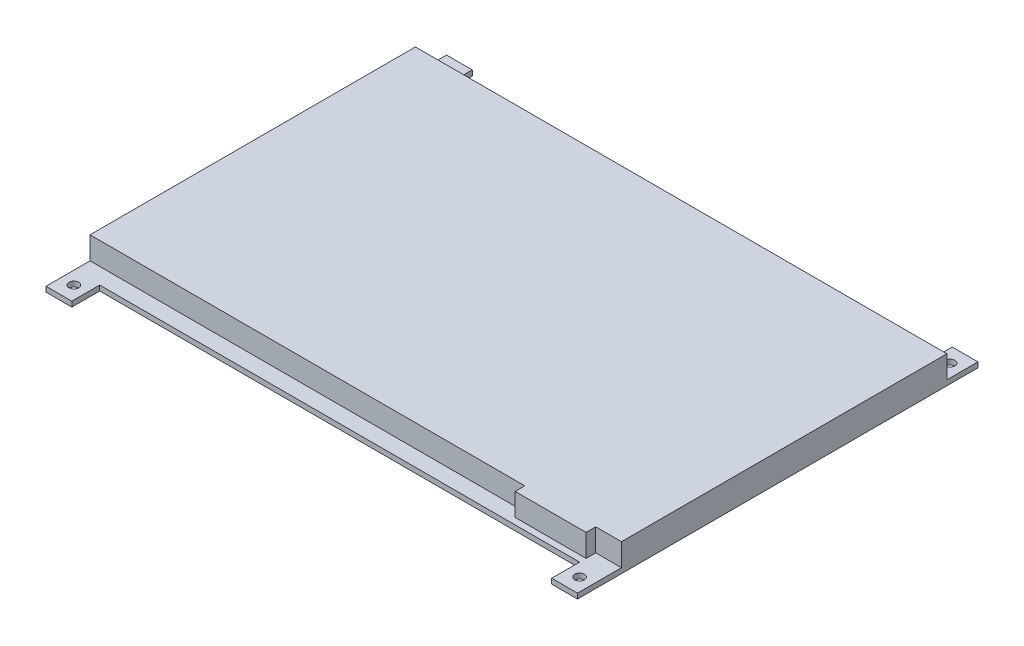
ISO-10303-21;
HEADER;
FILE_DESCRIPTION(('STEP AP214'),'2;1');
FILE_NAME('part.step','',(''),(''),'','','');
FILE_SCHEMA(('AUTOMOTIVE_DESIGN { 1 0 10303 214 1 1 1 1 }'));
ENDSEC;
DATA;
#1=APPLICATION_CONTEXT('core data for automotive mechanical design processes');
#2=APPLICATION_PROTOCOL_DEFINITION('international standard','automotive_design',2000,#1);
#3=PRODUCT_CONTEXT('',#1,'mechanical');
#4=PRODUCT('Part','Part','',(#3));
#5=PRODUCT_RELATED_PRODUCT_CATEGORY('part','',(#4));
#6=PRODUCT_DEFINITION_FORMATION('','',#4);
#7=PRODUCT_DEFINITION_CONTEXT('part definition',#1,'design');
#8=PRODUCT_DEFINITION('design','',#6,#7);
#9=PRODUCT_DEFINITION_SHAPE('','',#8);
#10=(LENGTH_UNIT() NAMED_UNIT(*) SI_UNIT(.MILLI.,.METRE.));
#11=(NAMED_UNIT(*) PLANE_ANGLE_UNIT() SI_UNIT($,.RADIAN.));
#12=(NAMED_UNIT(*) SI_UNIT($,.STERADIAN.) SOLID_ANGLE_UNIT());
#13=UNCERTAINTY_MEASURE_WITH_UNIT(LENGTH_MEASURE(1.E-05),#10,'distance_accuracy_value','');
#14=(GEOMETRIC_REPRESENTATION_CONTEXT(3) GLOBAL_UNCERTAINTY_ASSIGNED_CONTEXT((#13)) GLOBAL_UNIT_ASSIGNED_CONTEXT((#10,
#11,#12)) REPRESENTATION_CONTEXT('',''));
#15=CARTESIAN_POINT('',(0.,0.,0.));
#16=DIRECTION('',(0.,0.,1.));
#17=DIRECTION('',(1.,0.,0.));
#18=AXIS2_PLACEMENT_3D('',#15,#16,#17);
#19=CARTESIAN_POINT('',(0.,1.6,0.));
#20=DIRECTION('',(0.,-1.,0.));
#21=DIRECTION('',(0.,0.,-1.));
#22=AXIS2_PLACEMENT_3D('',#19,#20,#21);
#23=PLANE('',#22);
#24=CARTESIAN_POINT('',(-163.387715517241,1.6,-91.1550025864502));
#25=DIRECTION('',(0.,1.,0.));
#26=DIRECTION('',(0.,0.,-1.));
#27=AXIS2_PLACEMENT_3D('',#24,#25,#26);
#28=CIRCLE('',#27,1.5);
#29=CARTESIAN_POINT('',(-163.387715517241,1.6,-92.6550025864502));
#30=VERTEX_POINT('',#29);
#31=EDGE_CURVE('E196',#30,#30,#28,.T.);
#32=ORIENTED_EDGE('',*,*,#31,.F.);
#33=EDGE_LOOP('',(#32));
#34=FACE_BOUND('',#33,.T.);
#35=CARTESIAN_POINT('',(-6.48771551724151,1.6,-91.1550025864503));
#36=DIRECTION('',(0.,1.,0.));
#37=DIRECTION('',(0.,0.,-1.));
#38=AXIS2_PLACEMENT_3D('',#35,#36,#37);
#39=CIRCLE('',#38,1.5);
#40=CARTESIAN_POINT('',(-6.48771551724151,1.6,-92.6550025864503));
#41=VERTEX_POINT('',#40);
#42=EDGE_CURVE('E211',#41,#41,#39,.T.);
#43=ORIENTED_EDGE('',*,*,#42,.F.);
#44=EDGE_LOOP('',(#43));
#45=FACE_BOUND('',#44,.T.);
#46=DIRECTION('',(-1.,0.,0.));
#47=VECTOR('',#46,1.);
#48=CARTESIAN_POINT('',(-167.387715517242,1.6,-86.1550025864503));
#49=LINE('',#48,#47);
#50=CARTESIAN_POINT('',(-2.48771551724138,1.6,-86.1550025864503));
#51=VERTEX_POINT('',#50);
#52=CARTESIAN_POINT('',(-167.387715517242,1.6,-86.1550025864503));
#53=VERTEX_POINT('',#52);
#54=EDGE_CURVE('E187',#51,#53,#49,.T.);
#55=ORIENTED_EDGE('',*,*,#54,.F.);
#56=DIRECTION('',(0.,0.,-1.));
#57=VECTOR('',#56,1.);
#58=CARTESIAN_POINT('',(-2.48771551724139,1.6,19.8049974135497));
#59=LINE('',#58,#57);
#60=CARTESIAN_POINT('',(-2.4877155172415,1.6,-95.8100025864503));
#61=VERTEX_POINT('',#60);
#62=EDGE_CURVE('E226',#51,#61,#59,.T.);
#63=ORIENTED_EDGE('',*,*,#62,.T.);
#64=DIRECTION('',(-1.,0.,0.));
#65=VECTOR('',#64,1.);
#66=CARTESIAN_POINT('',(-10.4877155172415,1.6,-95.8100025864503));
#67=LINE('',#66,#65);
#68=CARTESIAN_POINT('',(-10.4877155172415,1.6,-95.8100025864503));
#69=VERTEX_POINT('',#68);
#70=EDGE_CURVE('E225',#61,#69,#67,.T.);
#71=ORIENTED_EDGE('',*,*,#70,.T.);
#72=DIRECTION('',(0.,0.,1.));
#73=VECTOR('',#72,1.);
#74=CARTESIAN_POINT('',(-10.4877155172415,1.6,-87.1550025864503));
#75=LINE('',#74,#73);
#76=CARTESIAN_POINT('',(-10.4877155172415,1.6,-87.1550025864503));
#77=VERTEX_POINT('',#76);
#78=EDGE_CURVE('E228',#69,#77,#75,.T.);
#79=ORIENTED_EDGE('',*,*,#78,.T.);
#80=DIRECTION('',(-1.,0.,0.));
#81=VECTOR('',#80,1.);
#82=CARTESIAN_POINT('',(-159.387715517242,1.6,-87.1550025864503));
#83=LINE('',#82,#81);
#84=CARTESIAN_POINT('',(-159.387715517242,1.6,-87.1550025864503));
#85=VERTEX_POINT('',#84);
#86=EDGE_CURVE('E230',#77,#85,#83,.T.);
#87=ORIENTED_EDGE('',*,*,#86,.T.);
#88=DIRECTION('',(0.,0.,-1.));
#89=VECTOR('',#88,1.);
#90=CARTESIAN_POINT('',(-159.387715517242,1.6,-95.8100025864503));
#91=LINE('',#90,#89);
#92=CARTESIAN_POINT('',(-159.387715517242,1.6,-95.8100025864503));
#93=VERTEX_POINT('',#92);
#94=EDGE_CURVE('E232',#85,#93,#91,.T.);
#95=ORIENTED_EDGE('',*,*,#94,.T.);
#96=DIRECTION('',(-1.,0.,0.));
#97=VECTOR('',#96,1.);
#98=CARTESIAN_POINT('',(-167.387715517242,1.6,-95.8100025864503));
#99=LINE('',#98,#97);
#100=CARTESIAN_POINT('',(-167.387715517242,1.6,-95.8100025864503));
#101=VERTEX_POINT('',#100);
#102=EDGE_CURVE('E234',#93,#101,#99,.T.);
#103=ORIENTED_EDGE('',*,*,#102,.T.);
#104=DIRECTION('',(0.,0.,1.));
#105=VECTOR('',#104,1.);
#106=CARTESIAN_POINT('',(-167.387715517242,1.6,-87.1550025864503));
#107=LINE('',#106,#105);
#108=EDGE_CURVE('E236',#101,#53,#107,.T.);
#109=ORIENTED_EDGE('',*,*,#108,.T.);
#110=EDGE_LOOP('',(#55,#63,#71,#79,#87,#95,#103,#109));
#111=FACE_BOUND('',#110,.T.);
#112=ADVANCED_FACE('F32',(#34,#45,#111),#23,.F.);
#113=CARTESIAN_POINT('',(-6.48771551724139,1.6,23.8049974135497));
#114=DIRECTION('',(0.,1.,0.));
#115=DIRECTION('',(0.,0.,1.));
#116=AXIS2_PLACEMENT_3D('',#113,#114,#115);
#117=CIRCLE('',#116,1.5);
#118=CARTESIAN_POINT('',(-6.48771551724139,1.6,25.3049974135497));
#119=VERTEX_POINT('',#118);
#120=EDGE_CURVE('E205',#119,#119,#117,.T.);
#121=ORIENTED_EDGE('',*,*,#120,.F.);
#122=EDGE_LOOP('',(#121));
#123=FACE_BOUND('',#122,.T.);
#124=CARTESIAN_POINT('',(-163.387715517241,1.6,23.8049974135497));
#125=DIRECTION('',(0.,1.,0.));
#126=DIRECTION('',(0.,0.,1.));
#127=AXIS2_PLACEMENT_3D('',#124,#125,#126);
#128=CIRCLE('',#127,1.5);
#129=CARTESIAN_POINT('',(-163.387715517241,1.6,25.3049974135497));
#130=VERTEX_POINT('',#129);
#131=EDGE_CURVE('E217',#130,#130,#128,.T.);
#132=ORIENTED_EDGE('',*,*,#131,.F.);
#133=EDGE_LOOP('',(#132));
#134=FACE_BOUND('',#133,.T.);
#135=DIRECTION('',(1.,0.,0.));
#136=VECTOR('',#135,1.);
#137=CARTESIAN_POINT('',(-10.4877155172414,1.6,14.8049974135497));
#138=LINE('',#137,#136);
#139=CARTESIAN_POINT('',(-10.4877155172414,1.6,14.8049974135497));
#140=VERTEX_POINT('',#139);
#141=CARTESIAN_POINT('',(-2.48771551724139,1.6,14.8049974135497));
#142=VERTEX_POINT('',#141);
#143=EDGE_CURVE('E47',#140,#142,#138,.T.);
#144=ORIENTED_EDGE('',*,*,#143,.F.);
#145=DIRECTION('',(0.,0.,-1.));
#146=VECTOR('',#145,1.);
#147=CARTESIAN_POINT('',(-10.4877155172414,1.6,17.8049974135497));
#148=LINE('',#147,#146);
#149=CARTESIAN_POINT('',(-10.4877155172414,1.6,17.8049974135497));
#150=VERTEX_POINT('',#149);
#151=EDGE_CURVE('E51',#150,#140,#148,.T.);
#152=ORIENTED_EDGE('',*,*,#151,.F.);
#153=DIRECTION('',(1.,0.,0.));
#154=VECTOR('',#153,1.);
#155=CARTESIAN_POINT('',(-32.4877155172414,1.6,17.8049974135497));
#156=LINE('',#155,#154);
#157=CARTESIAN_POINT('',(-32.4877155172414,1.6,17.8049974135497));
#158=VERTEX_POINT('',#157);
#159=EDGE_CURVE('E389',#158,#150,#156,.T.);
#160=ORIENTED_EDGE('',*,*,#159,.F.);
#161=DIRECTION('',(0.,0.,1.));
#162=VECTOR('',#161,1.);
#163=CARTESIAN_POINT('',(-32.4877155172414,1.6,14.8049974135497));
#164=LINE('',#163,#162);
#165=CARTESIAN_POINT('',(-32.4877155172414,1.6,14.8049974135497));
#166=VERTEX_POINT('',#165);
#167=EDGE_CURVE('E394',#166,#158,#164,.T.);
#168=ORIENTED_EDGE('',*,*,#167,.F.);
#169=DIRECTION('',(1.,0.,0.));
#170=VECTOR('',#169,1.);
#171=CARTESIAN_POINT('',(-167.387715517242,1.6,14.8049974135498));
#172=LINE('',#171,#170);
#173=CARTESIAN_POINT('',(-167.387715517241,1.6,14.8049974135498));
#174=VERTEX_POINT('',#173);
#175=EDGE_CURVE('E395',#174,#166,#172,.T.);
#176=ORIENTED_EDGE('',*,*,#175,.F.);
#177=CARTESIAN_POINT('',(-167.387715517241,1.6,28.4599974135497));
#178=VERTEX_POINT('',#177);
#179=EDGE_CURVE('E192',#174,#178,#107,.T.);
#180=ORIENTED_EDGE('',*,*,#179,.T.);
#181=DIRECTION('',(1.,0.,0.));
#182=VECTOR('',#181,1.);
#183=CARTESIAN_POINT('',(-159.387715517241,1.6,28.4599974135497));
#184=LINE('',#183,#182);
#185=CARTESIAN_POINT('',(-159.387715517241,1.6,28.4599974135497));
#186=VERTEX_POINT('',#185);
#187=EDGE_CURVE('E238',#178,#186,#184,.T.);
#188=ORIENTED_EDGE('',*,*,#187,.T.);
#189=DIRECTION('',(0.,0.,-1.));
#190=VECTOR('',#189,1.);
#191=CARTESIAN_POINT('',(-159.387715517242,1.6,19.8049974135497));
#192=LINE('',#191,#190);
#193=CARTESIAN_POINT('',(-159.387715517242,1.6,19.8049974135497));
#194=VERTEX_POINT('',#193);
#195=EDGE_CURVE('E240',#186,#194,#192,.T.);
#196=ORIENTED_EDGE('',*,*,#195,.T.);
#197=DIRECTION('',(1.,0.,0.));
#198=VECTOR('',#197,1.);
#199=CARTESIAN_POINT('',(-10.4877155172415,1.6,19.8049974135497));
#200=LINE('',#199,#198);
#201=CARTESIAN_POINT('',(-10.4877155172415,1.6,19.8049974135497));
#202=VERTEX_POINT('',#201);
#203=EDGE_CURVE('E242',#194,#202,#200,.T.);
#204=ORIENTED_EDGE('',*,*,#203,.T.);
#205=DIRECTION('',(0.,0.,1.));
#206=VECTOR('',#205,1.);
#207=CARTESIAN_POINT('',(-10.4877155172414,1.6,28.4599974135497));
#208=LINE('',#207,#206);
#209=CARTESIAN_POINT('',(-10.4877155172414,1.6,28.4599974135497));
#210=VERTEX_POINT('',#209);
#211=EDGE_CURVE('E244',#202,#210,#208,.T.);
#212=ORIENTED_EDGE('',*,*,#211,.T.);
#213=DIRECTION('',(1.,0.,0.));
#214=VECTOR('',#213,1.);
#215=CARTESIAN_POINT('',(-2.48771551724139,1.6,28.4599974135497));
#216=LINE('',#215,#214);
#217=CARTESIAN_POINT('',(-2.48771551724139,1.6,28.4599974135497));
#218=VERTEX_POINT('',#217);
#219=EDGE_CURVE('E246',#210,#218,#216,.T.);
#220=ORIENTED_EDGE('',*,*,#219,.T.);
#221=EDGE_CURVE('E223',#218,#142,#59,.T.);
#222=ORIENTED_EDGE('',*,*,#221,.T.);
#223=EDGE_LOOP('',(#144,#152,#160,#168,#176,#180,#188,#196,#204,#212,#220,#222));
#224=FACE_BOUND('',#223,.T.);
#225=ADVANCED_FACE('F417',(#123,#134,#224),#23,.F.);
#226=CARTESIAN_POINT('',(0.,0.,0.));
#227=DIRECTION('',(0.,-1.,0.));
#228=DIRECTION('',(0.,0.,-1.));
#229=AXIS2_PLACEMENT_3D('',#226,#227,#228);
#230=PLANE('',#229);
#231=CARTESIAN_POINT('',(-6.48771551724139,0.,23.8049974135497));
#232=DIRECTION('',(0.,1.,0.));
#233=DIRECTION('',(0.,0.,1.));
#234=AXIS2_PLACEMENT_3D('',#231,#232,#233);
#235=CIRCLE('',#234,1.5);
#236=CARTESIAN_POINT('',(-6.48771551724139,0.,25.3049974135497));
#237=VERTEX_POINT('',#236);
#238=EDGE_CURVE('E203',#237,#237,#235,.T.);
#239=ORIENTED_EDGE('',*,*,#238,.T.);
#240=EDGE_LOOP('',(#239));
#241=FACE_BOUND('',#240,.T.);
#242=CARTESIAN_POINT('',(-163.387715517241,0.,23.8049974135497));
#243=DIRECTION('',(0.,1.,0.));
#244=DIRECTION('',(0.,0.,1.));
#245=AXIS2_PLACEMENT_3D('',#242,#243,#244);
#246=CIRCLE('',#245,1.5);
#247=CARTESIAN_POINT('',(-163.387715517241,0.,25.3049974135497));
#248=VERTEX_POINT('',#247);
#249=EDGE_CURVE('E214',#248,#248,#246,.T.);
#250=ORIENTED_EDGE('',*,*,#249,.T.);
#251=EDGE_LOOP('',(#250));
#252=FACE_BOUND('',#251,.T.);
#253=DIRECTION('',(0.,0.,-1.));
#254=VECTOR('',#253,1.);
#255=CARTESIAN_POINT('',(-2.4877155172415,0.,-95.8100025864503));
#256=LINE('',#255,#254);
#257=CARTESIAN_POINT('',(-2.48771551724139,0.,28.4599974135497));
#258=VERTEX_POINT('',#257);
#259=CARTESIAN_POINT('',(-2.4877155172415,0.,-95.8100025864503));
#260=VERTEX_POINT('',#259);
#261=EDGE_CURVE('E220',#258,#260,#256,.T.);
#262=ORIENTED_EDGE('',*,*,#261,.F.);
#263=DIRECTION('',(1.,0.,0.));
#264=VECTOR('',#263,1.);
#265=CARTESIAN_POINT('',(-2.48771551724139,0.,28.4599974135497));
#266=LINE('',#265,#264);
#267=CARTESIAN_POINT('',(-10.4877155172414,0.,28.4599974135497));
#268=VERTEX_POINT('',#267);
#269=EDGE_CURVE('E271',#268,#258,#266,.T.);
#270=ORIENTED_EDGE('',*,*,#269,.F.);
#271=DIRECTION('',(0.,0.,1.));
#272=VECTOR('',#271,1.);
#273=CARTESIAN_POINT('',(-10.4877155172414,0.,28.4599974135497));
#274=LINE('',#273,#272);
#275=CARTESIAN_POINT('',(-10.4877155172415,0.,19.8049974135497));
#276=VERTEX_POINT('',#275);
#277=EDGE_CURVE('E269',#276,#268,#274,.T.);
#278=ORIENTED_EDGE('',*,*,#277,.F.);
#279=DIRECTION('',(1.,0.,0.));
#280=VECTOR('',#279,1.);
#281=CARTESIAN_POINT('',(-10.4877155172415,0.,19.8049974135497));
#282=LINE('',#281,#280);
#283=CARTESIAN_POINT('',(-159.387715517242,0.,19.8049974135497));
#284=VERTEX_POINT('',#283);
#285=EDGE_CURVE('E267',#284,#276,#282,.T.);
#286=ORIENTED_EDGE('',*,*,#285,.F.);
#287=DIRECTION('',(0.,0.,-1.));
#288=VECTOR('',#287,1.);
#289=CARTESIAN_POINT('',(-159.387715517242,0.,19.8049974135497));
#290=LINE('',#289,#288);
#291=CARTESIAN_POINT('',(-159.387715517241,0.,28.4599974135497));
#292=VERTEX_POINT('',#291);
#293=EDGE_CURVE('E265',#292,#284,#290,.T.);
#294=ORIENTED_EDGE('',*,*,#293,.F.);
#295=DIRECTION('',(1.,0.,0.));
#296=VECTOR('',#295,1.);
#297=CARTESIAN_POINT('',(-159.387715517241,0.,28.4599974135497));
#298=LINE('',#297,#296);
#299=CARTESIAN_POINT('',(-167.387715517241,0.,28.4599974135497));
#300=VERTEX_POINT('',#299);
#301=EDGE_CURVE('E263',#300,#292,#298,.T.);
#302=ORIENTED_EDGE('',*,*,#301,.F.);
#303=DIRECTION('',(0.,0.,1.));
#304=VECTOR('',#303,1.);
#305=CARTESIAN_POINT('',(-167.387715517241,0.,28.4599974135497));
#306=LINE('',#305,#304);
#307=CARTESIAN_POINT('',(-167.387715517242,0.,-95.8100025864503));
#308=VERTEX_POINT('',#307);
#309=EDGE_CURVE('E261',#308,#300,#306,.T.);
#310=ORIENTED_EDGE('',*,*,#309,.F.);
#311=DIRECTION('',(-1.,0.,0.));
#312=VECTOR('',#311,1.);
#313=CARTESIAN_POINT('',(-167.387715517242,0.,-95.8100025864503));
#314=LINE('',#313,#312);
#315=CARTESIAN_POINT('',(-159.387715517242,0.,-95.8100025864503));
#316=VERTEX_POINT('',#315);
#317=EDGE_CURVE('E258',#316,#308,#314,.T.);
#318=ORIENTED_EDGE('',*,*,#317,.F.);
#319=DIRECTION('',(0.,0.,-1.));
#320=VECTOR('',#319,1.);
#321=CARTESIAN_POINT('',(-159.387715517242,0.,-95.8100025864503));
#322=LINE('',#321,#320);
#323=CARTESIAN_POINT('',(-159.387715517242,0.,-87.1550025864503));
#324=VERTEX_POINT('',#323);
#325=EDGE_CURVE('E256',#324,#316,#322,.T.);
#326=ORIENTED_EDGE('',*,*,#325,.F.);
#327=DIRECTION('',(-1.,0.,0.));
#328=VECTOR('',#327,1.);
#329=CARTESIAN_POINT('',(-159.387715517242,0.,-87.1550025864503));
#330=LINE('',#329,#328);
#331=CARTESIAN_POINT('',(-10.4877155172415,0.,-87.1550025864503));
#332=VERTEX_POINT('',#331);
#333=EDGE_CURVE('E254',#332,#324,#330,.T.);
#334=ORIENTED_EDGE('',*,*,#333,.F.);
#335=DIRECTION('',(0.,0.,1.));
#336=VECTOR('',#335,1.);
#337=CARTESIAN_POINT('',(-10.4877155172415,0.,-87.1550025864503));
#338=LINE('',#337,#336);
#339=CARTESIAN_POINT('',(-10.4877155172415,0.,-95.8100025864503));
#340=VERTEX_POINT('',#339);
#341=EDGE_CURVE('E252',#340,#332,#338,.T.);
#342=ORIENTED_EDGE('',*,*,#341,.F.);
#343=DIRECTION('',(-1.,0.,0.));
#344=VECTOR('',#343,1.);
#345=CARTESIAN_POINT('',(-10.4877155172415,0.,-95.8100025864503));
#346=LINE('',#345,#344);
#347=EDGE_CURVE('E250',#260,#340,#346,.T.);
#348=ORIENTED_EDGE('',*,*,#347,.F.);
#349=EDGE_LOOP('',(#262,#270,#278,#286,#294,#302,#310,#318,#326,#334,#342,#348));
#350=FACE_BOUND('',#349,.T.);
#351=CARTESIAN_POINT('',(-6.48771551724151,0.,-91.1550025864503));
#352=DIRECTION('',(0.,1.,0.));
#353=DIRECTION('',(0.,0.,-1.));
#354=AXIS2_PLACEMENT_3D('',#351,#352,#353);
#355=CIRCLE('',#354,1.5);
#356=CARTESIAN_POINT('',(-6.48771551724151,0.,-92.6550025864503));
#357=VERTEX_POINT('',#356);
#358=EDGE_CURVE('E208',#357,#357,#355,.T.);
#359=ORIENTED_EDGE('',*,*,#358,.T.);
#360=EDGE_LOOP('',(#359));
#361=FACE_BOUND('',#360,.T.);
#362=CARTESIAN_POINT('',(-163.387715517241,0.,-91.1550025864502));
#363=DIRECTION('',(0.,1.,0.));
#364=DIRECTION('',(0.,0.,-1.));
#365=AXIS2_PLACEMENT_3D('',#362,#363,#364);
#366=CIRCLE('',#365,1.5);
#367=CARTESIAN_POINT('',(-163.387715517241,0.,-92.6550025864502));
#368=VERTEX_POINT('',#367);
#369=EDGE_CURVE('E193',#368,#368,#366,.T.);
#370=ORIENTED_EDGE('',*,*,#369,.T.);
#371=EDGE_LOOP('',(#370));
#372=FACE_BOUND('',#371,.T.);
#373=ADVANCED_FACE('F314',(#241,#252,#350,#361,#372),#230,.T.);
#374=CARTESIAN_POINT('',(-2.4877155172415,1.6,-95.8100025864503));
#375=DIRECTION('',(-1.,0.,0.));
#376=DIRECTION('',(0.,0.,1.));
#377=AXIS2_PLACEMENT_3D('',#374,#375,#376);
#378=PLANE('',#377);
#379=ORIENTED_EDGE('',*,*,#261,.T.);
#380=DIRECTION('',(0.,-1.,0.));
#381=VECTOR('',#380,1.);
#382=CARTESIAN_POINT('',(-2.4877155172415,1.6,-95.8100025864503));
#383=LINE('',#382,#381);
#384=EDGE_CURVE('E11',#61,#260,#383,.T.);
#385=ORIENTED_EDGE('',*,*,#384,.F.);
#386=ORIENTED_EDGE('',*,*,#62,.F.);
#387=DIRECTION('',(0.,-1.,0.));
#388=VECTOR('',#387,1.);
#389=CARTESIAN_POINT('',(-2.48771551724139,8.6,-86.1550025864503));
#390=LINE('',#389,#388);
#391=CARTESIAN_POINT('',(-2.48771551724139,8.6,-86.1550025864503));
#392=VERTEX_POINT('',#391);
#393=EDGE_CURVE('E368',#392,#51,#390,.T.);
#394=ORIENTED_EDGE('',*,*,#393,.F.);
#395=DIRECTION('',(0.,0.,-1.));
#396=VECTOR('',#395,1.);
#397=CARTESIAN_POINT('',(-2.48771551724139,8.6,-86.1550025864503));
#398=LINE('',#397,#396);
#399=CARTESIAN_POINT('',(-2.48771551724138,8.6,14.8049974135497));
#400=VERTEX_POINT('',#399);
#401=EDGE_CURVE('E410',#400,#392,#398,.T.);
#402=ORIENTED_EDGE('',*,*,#401,.F.);
#403=DIRECTION('',(0.,-1.,0.));
#404=VECTOR('',#403,1.);
#405=CARTESIAN_POINT('',(-2.48771551724138,8.6,14.8049974135497));
#406=LINE('',#405,#404);
#407=EDGE_CURVE('E375',#400,#142,#406,.T.);
#408=ORIENTED_EDGE('',*,*,#407,.T.);
#409=ORIENTED_EDGE('',*,*,#221,.F.);
#410=DIRECTION('',(0.,-1.,0.));
#411=VECTOR('',#410,1.);
#412=CARTESIAN_POINT('',(-2.48771551724139,1.6,28.4599974135497));
#413=LINE('',#412,#411);
#414=EDGE_CURVE('E248',#218,#258,#413,.T.);
#415=ORIENTED_EDGE('',*,*,#414,.T.);
#416=EDGE_LOOP('',(#379,#385,#386,#394,#402,#408,#409,#415));
#417=FACE_BOUND('',#416,.T.);
#418=ADVANCED_FACE('F34',(#417),#378,.F.);
#419=CARTESIAN_POINT('',(-10.4877155172415,1.6,-95.8100025864503));
#420=DIRECTION('',(0.,0.,1.));
#421=DIRECTION('',(1.,0.,0.));
#422=AXIS2_PLACEMENT_3D('',#419,#420,#421);
#423=PLANE('',#422);
#424=ORIENTED_EDGE('',*,*,#347,.T.);
#425=DIRECTION('',(0.,-1.,0.));
#426=VECTOR('',#425,1.);
#427=CARTESIAN_POINT('',(-10.4877155172415,1.6,-95.8100025864503));
#428=LINE('',#427,#426);
#429=EDGE_CURVE('E40',#69,#340,#428,.T.);
#430=ORIENTED_EDGE('',*,*,#429,.F.);
#431=ORIENTED_EDGE('',*,*,#70,.F.);
#432=ORIENTED_EDGE('',*,*,#384,.T.);
#433=EDGE_LOOP('',(#424,#430,#431,#432));
#434=FACE_BOUND('',#433,.T.);
#435=ADVANCED_FACE('F331',(#434),#423,.F.);
#436=CARTESIAN_POINT('',(-10.4877155172415,1.6,-87.1550025864503));
#437=DIRECTION('',(1.,0.,0.));
#438=DIRECTION('',(0.,0.,-1.));
#439=AXIS2_PLACEMENT_3D('',#436,#437,#438);
#440=PLANE('',#439);
#441=ORIENTED_EDGE('',*,*,#341,.T.);
#442=DIRECTION('',(0.,-1.,0.));
#443=VECTOR('',#442,1.);
#444=CARTESIAN_POINT('',(-10.4877155172415,1.6,-87.1550025864503));
#445=LINE('',#444,#443);
#446=EDGE_CURVE('E300',#77,#332,#445,.T.);
#447=ORIENTED_EDGE('',*,*,#446,.F.);
#448=ORIENTED_EDGE('',*,*,#78,.F.);
#449=ORIENTED_EDGE('',*,*,#429,.T.);
#450=EDGE_LOOP('',(#441,#447,#448,#449));
#451=FACE_BOUND('',#450,.T.);
#452=ADVANCED_FACE('F307',(#451),#440,.F.);
#453=CARTESIAN_POINT('',(-159.387715517242,1.6,-87.1550025864503));
#454=DIRECTION('',(0.,0.,1.));
#455=DIRECTION('',(1.,0.,0.));
#456=AXIS2_PLACEMENT_3D('',#453,#454,#455);
#457=PLANE('',#456);
#458=ORIENTED_EDGE('',*,*,#333,.T.);
#459=DIRECTION('',(0.,-1.,0.));
#460=VECTOR('',#459,1.);
#461=CARTESIAN_POINT('',(-159.387715517242,1.6,-87.1550025864503));
#462=LINE('',#461,#460);
#463=EDGE_CURVE('E297',#85,#324,#462,.T.);
#464=ORIENTED_EDGE('',*,*,#463,.F.);
#465=ORIENTED_EDGE('',*,*,#86,.F.);
#466=ORIENTED_EDGE('',*,*,#446,.T.);
#467=EDGE_LOOP('',(#458,#464,#465,#466));
#468=FACE_BOUND('',#467,.T.);
#469=ADVANCED_FACE('F320',(#468),#457,.F.);
#470=CARTESIAN_POINT('',(-159.387715517242,1.6,-95.8100025864503));
#471=DIRECTION('',(-1.,0.,0.));
#472=DIRECTION('',(0.,0.,1.));
#473=AXIS2_PLACEMENT_3D('',#470,#471,#472);
#474=PLANE('',#473);
#475=ORIENTED_EDGE('',*,*,#325,.T.);
#476=DIRECTION('',(0.,-1.,0.));
#477=VECTOR('',#476,1.);
#478=CARTESIAN_POINT('',(-159.387715517242,1.6,-95.8100025864503));
#479=LINE('',#478,#477);
#480=EDGE_CURVE('E294',#93,#316,#479,.T.);
#481=ORIENTED_EDGE('',*,*,#480,.F.);
#482=ORIENTED_EDGE('',*,*,#94,.F.);
#483=ORIENTED_EDGE('',*,*,#463,.T.);
#484=EDGE_LOOP('',(#475,#481,#482,#483));
#485=FACE_BOUND('',#484,.T.);
#486=ADVANCED_FACE('F324',(#485),#474,.F.);
#487=CARTESIAN_POINT('',(-167.387715517242,1.6,-95.8100025864503));
#488=DIRECTION('',(0.,0.,1.));
#489=DIRECTION('',(1.,0.,0.));
#490=AXIS2_PLACEMENT_3D('',#487,#488,#489);
#491=PLANE('',#490);
#492=ORIENTED_EDGE('',*,*,#317,.T.);
#493=DIRECTION('',(0.,-1.,0.));
#494=VECTOR('',#493,1.);
#495=CARTESIAN_POINT('',(-167.387715517242,1.6,-95.8100025864503));
#496=LINE('',#495,#494);
#497=EDGE_CURVE('E291',#101,#308,#496,.T.);
#498=ORIENTED_EDGE('',*,*,#497,.F.);
#499=ORIENTED_EDGE('',*,*,#102,.F.);
#500=ORIENTED_EDGE('',*,*,#480,.T.);
#501=EDGE_LOOP('',(#492,#498,#499,#500));
#502=FACE_BOUND('',#501,.T.);
#503=ADVANCED_FACE('F362',(#502),#491,.F.);
#504=CARTESIAN_POINT('',(-167.387715517241,1.6,28.4599974135497));
#505=DIRECTION('',(1.,0.,0.));
#506=DIRECTION('',(0.,0.,-1.));
#507=AXIS2_PLACEMENT_3D('',#504,#505,#506);
#508=PLANE('',#507);
#509=ORIENTED_EDGE('',*,*,#309,.T.);
#510=DIRECTION('',(0.,-1.,0.));
#511=VECTOR('',#510,1.);
#512=CARTESIAN_POINT('',(-167.387715517241,1.6,28.4599974135497));
#513=LINE('',#512,#511);
#514=EDGE_CURVE('E288',#178,#300,#513,.T.);
#515=ORIENTED_EDGE('',*,*,#514,.F.);
#516=ORIENTED_EDGE('',*,*,#179,.F.);
#517=DIRECTION('',(0.,-1.,0.));
#518=VECTOR('',#517,1.);
#519=CARTESIAN_POINT('',(-167.387715517242,8.6,14.8049974135498));
#520=LINE('',#519,#518);
#521=CARTESIAN_POINT('',(-167.387715517242,8.6,14.8049974135498));
#522=VERTEX_POINT('',#521);
#523=EDGE_CURVE('E172',#522,#174,#520,.T.);
#524=ORIENTED_EDGE('',*,*,#523,.F.);
#525=DIRECTION('',(0.,0.,1.));
#526=VECTOR('',#525,1.);
#527=CARTESIAN_POINT('',(-167.387715517242,8.6,-86.1550025864503));
#528=LINE('',#527,#526);
#529=CARTESIAN_POINT('',(-167.387715517242,8.6,-86.1550025864503));
#530=VERTEX_POINT('',#529);
#531=EDGE_CURVE('E178',#530,#522,#528,.T.);
#532=ORIENTED_EDGE('',*,*,#531,.F.);
#533=DIRECTION('',(0.,-1.,0.));
#534=VECTOR('',#533,1.);
#535=CARTESIAN_POINT('',(-167.387715517242,8.6,-86.1550025864503));
#536=LINE('',#535,#534);
#537=EDGE_CURVE('E364',#530,#53,#536,.T.);
#538=ORIENTED_EDGE('',*,*,#537,.T.);
#539=ORIENTED_EDGE('',*,*,#108,.F.);
#540=ORIENTED_EDGE('',*,*,#497,.T.);
#541=EDGE_LOOP('',(#509,#515,#516,#524,#532,#538,#539,#540));
#542=FACE_BOUND('',#541,.T.);
#543=ADVANCED_FACE('F190',(#542),#508,.F.);
#544=CARTESIAN_POINT('',(-159.387715517241,1.6,28.4599974135497));
#545=DIRECTION('',(0.,0.,-1.));
#546=DIRECTION('',(-1.,0.,0.));
#547=AXIS2_PLACEMENT_3D('',#544,#545,#546);
#548=PLANE('',#547);
#549=ORIENTED_EDGE('',*,*,#301,.T.);
#550=DIRECTION('',(0.,-1.,0.));
#551=VECTOR('',#550,1.);
#552=CARTESIAN_POINT('',(-159.387715517241,1.6,28.4599974135497));
#553=LINE('',#552,#551);
#554=EDGE_CURVE('E285',#186,#292,#553,.T.);
#555=ORIENTED_EDGE('',*,*,#554,.F.);
#556=ORIENTED_EDGE('',*,*,#187,.F.);
#557=ORIENTED_EDGE('',*,*,#514,.T.);
#558=EDGE_LOOP('',(#549,#555,#556,#557));
#559=FACE_BOUND('',#558,.T.);
#560=ADVANCED_FACE('F360',(#559),#548,.F.);
#561=CARTESIAN_POINT('',(-159.387715517242,1.6,19.8049974135497));
#562=DIRECTION('',(-1.,0.,0.));
#563=DIRECTION('',(0.,0.,1.));
#564=AXIS2_PLACEMENT_3D('',#561,#562,#563);
#565=PLANE('',#564);
#566=ORIENTED_EDGE('',*,*,#293,.T.);
#567=DIRECTION('',(0.,-1.,0.));
#568=VECTOR('',#567,1.);
#569=CARTESIAN_POINT('',(-159.387715517242,1.6,19.8049974135497));
#570=LINE('',#569,#568);
#571=EDGE_CURVE('E282',#194,#284,#570,.T.);
#572=ORIENTED_EDGE('',*,*,#571,.F.);
#573=ORIENTED_EDGE('',*,*,#195,.F.);
#574=ORIENTED_EDGE('',*,*,#554,.T.);
#575=EDGE_LOOP('',(#566,#572,#573,#574));
#576=FACE_BOUND('',#575,.T.);
#577=ADVANCED_FACE('F356',(#576),#565,.F.);
#578=CARTESIAN_POINT('',(-10.4877155172415,1.6,19.8049974135497));
#579=DIRECTION('',(0.,0.,-1.));
#580=DIRECTION('',(-1.,0.,0.));
#581=AXIS2_PLACEMENT_3D('',#578,#579,#580);
#582=PLANE('',#581);
#583=ORIENTED_EDGE('',*,*,#285,.T.);
#584=DIRECTION('',(0.,-1.,0.));
#585=VECTOR('',#584,1.);
#586=CARTESIAN_POINT('',(-10.4877155172415,1.6,19.8049974135497));
#587=LINE('',#586,#585);
#588=EDGE_CURVE('E279',#202,#276,#587,.T.);
#589=ORIENTED_EDGE('',*,*,#588,.F.);
#590=ORIENTED_EDGE('',*,*,#203,.F.);
#591=ORIENTED_EDGE('',*,*,#571,.T.);
#592=EDGE_LOOP('',(#583,#589,#590,#591));
#593=FACE_BOUND('',#592,.T.);
#594=ADVANCED_FACE('F351',(#593),#582,.F.);
#595=CARTESIAN_POINT('',(-10.4877155172414,1.6,28.4599974135497));
#596=DIRECTION('',(1.,0.,0.));
#597=DIRECTION('',(0.,0.,-1.));
#598=AXIS2_PLACEMENT_3D('',#595,#596,#597);
#599=PLANE('',#598);
#600=ORIENTED_EDGE('',*,*,#277,.T.);
#601=DIRECTION('',(0.,-1.,0.));
#602=VECTOR('',#601,1.);
#603=CARTESIAN_POINT('',(-10.4877155172414,1.6,28.4599974135497));
#604=LINE('',#603,#602);
#605=EDGE_CURVE('E276',#210,#268,#604,.T.);
#606=ORIENTED_EDGE('',*,*,#605,.F.);
#607=ORIENTED_EDGE('',*,*,#211,.F.);
#608=ORIENTED_EDGE('',*,*,#588,.T.);
#609=EDGE_LOOP('',(#600,#606,#607,#608));
#610=FACE_BOUND('',#609,.T.);
#611=ADVANCED_FACE('F345',(#610),#599,.F.);
#612=CARTESIAN_POINT('',(-2.48771551724139,1.6,28.4599974135497));
#613=DIRECTION('',(0.,0.,-1.));
#614=DIRECTION('',(-1.,0.,0.));
#615=AXIS2_PLACEMENT_3D('',#612,#613,#614);
#616=PLANE('',#615);
#617=ORIENTED_EDGE('',*,*,#269,.T.);
#618=ORIENTED_EDGE('',*,*,#414,.F.);
#619=ORIENTED_EDGE('',*,*,#219,.F.);
#620=ORIENTED_EDGE('',*,*,#605,.T.);
#621=EDGE_LOOP('',(#617,#618,#619,#620));
#622=FACE_BOUND('',#621,.T.);
#623=ADVANCED_FACE('F340',(#622),#616,.F.);
#624=CARTESIAN_POINT('',(-163.387715517241,1.6,23.8049974135497));
#625=DIRECTION('',(0.,-1.,0.));
#626=DIRECTION('',(0.,0.,-1.));
#627=AXIS2_PLACEMENT_3D('',#624,#625,#626);
#628=CYLINDRICAL_SURFACE('',#627,1.5);
#629=ORIENTED_EDGE('',*,*,#131,.T.);
#630=EDGE_LOOP('',(#629));
#631=FACE_BOUND('',#630,.T.);
#632=ORIENTED_EDGE('',*,*,#249,.F.);
#633=EDGE_LOOP('',(#632));
#634=FACE_BOUND('',#633,.T.);
#635=ADVANCED_FACE('F431',(#631,#634),#628,.F.);
#636=CARTESIAN_POINT('',(-6.48771551724151,1.6,-91.1550025864503));
#637=DIRECTION('',(0.,-1.,0.));
#638=DIRECTION('',(0.,0.,-1.));
#639=AXIS2_PLACEMENT_3D('',#636,#637,#638);
#640=CYLINDRICAL_SURFACE('',#639,1.5);
#641=ORIENTED_EDGE('',*,*,#42,.T.);
#642=EDGE_LOOP('',(#641));
#643=FACE_BOUND('',#642,.T.);
#644=ORIENTED_EDGE('',*,*,#358,.F.);
#645=EDGE_LOOP('',(#644));
#646=FACE_BOUND('',#645,.T.);
#647=ADVANCED_FACE('F535',(#643,#646),#640,.F.);
#648=CARTESIAN_POINT('',(-6.48771551724139,1.6,23.8049974135497));
#649=DIRECTION('',(0.,-1.,0.));
#650=DIRECTION('',(0.,0.,-1.));
#651=AXIS2_PLACEMENT_3D('',#648,#649,#650);
#652=CYLINDRICAL_SURFACE('',#651,1.5);
#653=ORIENTED_EDGE('',*,*,#120,.T.);
#654=EDGE_LOOP('',(#653));
#655=FACE_BOUND('',#654,.T.);
#656=ORIENTED_EDGE('',*,*,#238,.F.);
#657=EDGE_LOOP('',(#656));
#658=FACE_BOUND('',#657,.T.);
#659=ADVANCED_FACE('F544',(#655,#658),#652,.F.);
#660=CARTESIAN_POINT('',(-163.387715517241,1.6,-91.1550025864502));
#661=DIRECTION('',(0.,-1.,0.));
#662=DIRECTION('',(0.,0.,-1.));
#663=AXIS2_PLACEMENT_3D('',#660,#661,#662);
#664=CYLINDRICAL_SURFACE('',#663,1.5);
#665=ORIENTED_EDGE('',*,*,#31,.T.);
#666=EDGE_LOOP('',(#665));
#667=FACE_BOUND('',#666,.T.);
#668=ORIENTED_EDGE('',*,*,#369,.F.);
#669=EDGE_LOOP('',(#668));
#670=FACE_BOUND('',#669,.T.);
#671=ADVANCED_FACE('F553',(#667,#670),#664,.F.);
#672=CARTESIAN_POINT('',(-167.387715517242,8.6,14.8049974135498));
#673=DIRECTION('',(0.,0.,-1.));
#674=DIRECTION('',(-1.,0.,0.));
#675=AXIS2_PLACEMENT_3D('',#672,#673,#674);
#676=PLANE('',#675);
#677=ORIENTED_EDGE('',*,*,#175,.T.);
#678=DIRECTION('',(0.,-1.,0.));
#679=VECTOR('',#678,1.);
#680=CARTESIAN_POINT('',(-32.4877155172414,8.6,14.8049974135497));
#681=LINE('',#680,#679);
#682=CARTESIAN_POINT('',(-32.4877155172414,8.6,14.8049974135497));
#683=VERTEX_POINT('',#682);
#684=EDGE_CURVE('E174',#683,#166,#681,.T.);
#685=ORIENTED_EDGE('',*,*,#684,.F.);
#686=DIRECTION('',(1.,0.,0.));
#687=VECTOR('',#686,1.);
#688=CARTESIAN_POINT('',(-167.387715517242,8.6,14.8049974135498));
#689=LINE('',#688,#687);
#690=EDGE_CURVE('E167',#522,#683,#689,.T.);
#691=ORIENTED_EDGE('',*,*,#690,.F.);
#692=ORIENTED_EDGE('',*,*,#523,.T.);
#693=EDGE_LOOP('',(#677,#685,#691,#692));
#694=FACE_BOUND('',#693,.T.);
#695=ADVANCED_FACE('F170',(#694),#676,.F.);
#696=CARTESIAN_POINT('',(-32.4877155172414,8.6,14.8049974135497));
#697=DIRECTION('',(1.,0.,0.));
#698=DIRECTION('',(0.,0.,-1.));
#699=AXIS2_PLACEMENT_3D('',#696,#697,#698);
#700=PLANE('',#699);
#701=ORIENTED_EDGE('',*,*,#167,.T.);
#702=DIRECTION('',(0.,-1.,0.));
#703=VECTOR('',#702,1.);
#704=CARTESIAN_POINT('',(-32.4877155172414,8.6,17.8049974135497));
#705=LINE('',#704,#703);
#706=CARTESIAN_POINT('',(-32.4877155172414,8.6,17.8049974135497));
#707=VERTEX_POINT('',#706);
#708=EDGE_CURVE('E198',#707,#158,#705,.T.);
#709=ORIENTED_EDGE('',*,*,#708,.F.);
#710=DIRECTION('',(0.,0.,1.));
#711=VECTOR('',#710,1.);
#712=CARTESIAN_POINT('',(-32.4877155172414,8.6,14.8049974135497));
#713=LINE('',#712,#711);
#714=EDGE_CURVE('E177',#683,#707,#713,.T.);
#715=ORIENTED_EDGE('',*,*,#714,.F.);
#716=ORIENTED_EDGE('',*,*,#684,.T.);
#717=EDGE_LOOP('',(#701,#709,#715,#716));
#718=FACE_BOUND('',#717,.T.);
#719=ADVANCED_FACE('F393',(#718),#700,.F.);
#720=CARTESIAN_POINT('',(-32.4877155172414,8.6,17.8049974135497));
#721=DIRECTION('',(0.,0.,-1.));
#722=DIRECTION('',(-1.,0.,0.));
#723=AXIS2_PLACEMENT_3D('',#720,#721,#722);
#724=PLANE('',#723);
#725=ORIENTED_EDGE('',*,*,#159,.T.);
#726=DIRECTION('',(0.,-1.,0.));
#727=VECTOR('',#726,1.);
#728=CARTESIAN_POINT('',(-10.4877155172414,8.6,17.8049974135497));
#729=LINE('',#728,#727);
#730=CARTESIAN_POINT('',(-10.4877155172414,8.6,17.8049974135497));
#731=VERTEX_POINT('',#730);
#732=EDGE_CURVE('E381',#731,#150,#729,.T.);
#733=ORIENTED_EDGE('',*,*,#732,.F.);
#734=DIRECTION('',(1.,0.,0.));
#735=VECTOR('',#734,1.);
#736=CARTESIAN_POINT('',(-32.4877155172414,8.6,17.8049974135497));
#737=LINE('',#736,#735);
#738=EDGE_CURVE('E390',#707,#731,#737,.T.);
#739=ORIENTED_EDGE('',*,*,#738,.F.);
#740=ORIENTED_EDGE('',*,*,#708,.T.);
#741=EDGE_LOOP('',(#725,#733,#739,#740));
#742=FACE_BOUND('',#741,.T.);
#743=ADVANCED_FACE('F387',(#742),#724,.F.);
#744=CARTESIAN_POINT('',(-10.4877155172414,8.6,17.8049974135497));
#745=DIRECTION('',(-1.,0.,0.));
#746=DIRECTION('',(0.,0.,1.));
#747=AXIS2_PLACEMENT_3D('',#744,#745,#746);
#748=PLANE('',#747);
#749=ORIENTED_EDGE('',*,*,#151,.T.);
#750=DIRECTION('',(0.,-1.,0.));
#751=VECTOR('',#750,1.);
#752=CARTESIAN_POINT('',(-10.4877155172414,8.6,14.8049974135497));
#753=LINE('',#752,#751);
#754=CARTESIAN_POINT('',(-10.4877155172414,8.6,14.8049974135497));
#755=VERTEX_POINT('',#754);
#756=EDGE_CURVE('E378',#755,#140,#753,.T.);
#757=ORIENTED_EDGE('',*,*,#756,.F.);
#758=DIRECTION('',(0.,0.,-1.));
#759=VECTOR('',#758,1.);
#760=CARTESIAN_POINT('',(-10.4877155172414,8.6,17.8049974135497));
#761=LINE('',#760,#759);
#762=EDGE_CURVE('E411',#731,#755,#761,.T.);
#763=ORIENTED_EDGE('',*,*,#762,.F.);
#764=ORIENTED_EDGE('',*,*,#732,.T.);
#765=EDGE_LOOP('',(#749,#757,#763,#764));
#766=FACE_BOUND('',#765,.T.);
#767=ADVANCED_FACE('F402',(#766),#748,.F.);
#768=CARTESIAN_POINT('',(-10.4877155172414,8.6,14.8049974135497));
#769=DIRECTION('',(0.,0.,-1.));
#770=DIRECTION('',(-1.,0.,0.));
#771=AXIS2_PLACEMENT_3D('',#768,#769,#770);
#772=PLANE('',#771);
#773=ORIENTED_EDGE('',*,*,#143,.T.);
#774=ORIENTED_EDGE('',*,*,#407,.F.);
#775=DIRECTION('',(1.,0.,0.));
#776=VECTOR('',#775,1.);
#777=CARTESIAN_POINT('',(-10.4877155172414,8.6,14.8049974135497));
#778=LINE('',#777,#776);
#779=EDGE_CURVE('E408',#755,#400,#778,.T.);
#780=ORIENTED_EDGE('',*,*,#779,.F.);
#781=ORIENTED_EDGE('',*,*,#756,.T.);
#782=EDGE_LOOP('',(#773,#774,#780,#781));
#783=FACE_BOUND('',#782,.T.);
#784=ADVANCED_FACE('F406',(#783),#772,.F.);
#785=CARTESIAN_POINT('',(-167.387715517242,8.6,-86.1550025864503));
#786=DIRECTION('',(0.,0.,1.));
#787=DIRECTION('',(1.,0.,0.));
#788=AXIS2_PLACEMENT_3D('',#785,#786,#787);
#789=PLANE('',#788);
#790=ORIENTED_EDGE('',*,*,#54,.T.);
#791=ORIENTED_EDGE('',*,*,#537,.F.);
#792=DIRECTION('',(-1.,0.,0.));
#793=VECTOR('',#792,1.);
#794=CARTESIAN_POINT('',(-167.387715517242,8.6,-86.1550025864503));
#795=LINE('',#794,#793);
#796=EDGE_CURVE('E183',#392,#530,#795,.T.);
#797=ORIENTED_EDGE('',*,*,#796,.F.);
#798=ORIENTED_EDGE('',*,*,#393,.T.);
#799=EDGE_LOOP('',(#790,#791,#797,#798));
#800=FACE_BOUND('',#799,.T.);
#801=ADVANCED_FACE('F367',(#800),#789,.F.);
#802=CARTESIAN_POINT('',(0.,8.6,0.));
#803=DIRECTION('',(0.,1.,0.));
#804=DIRECTION('',(0.,0.,1.));
#805=AXIS2_PLACEMENT_3D('',#802,#803,#804);
#806=PLANE('',#805);
#807=ORIENTED_EDGE('',*,*,#531,.T.);
#808=ORIENTED_EDGE('',*,*,#690,.T.);
#809=ORIENTED_EDGE('',*,*,#714,.T.);
#810=ORIENTED_EDGE('',*,*,#738,.T.);
#811=ORIENTED_EDGE('',*,*,#762,.T.);
#812=ORIENTED_EDGE('',*,*,#779,.T.);
#813=ORIENTED_EDGE('',*,*,#401,.T.);
#814=ORIENTED_EDGE('',*,*,#796,.T.);
#815=EDGE_LOOP('',(#807,#808,#809,#810,#811,#812,#813,#814));
#816=FACE_BOUND('',#815,.T.);
#817=ADVANCED_FACE('F181',(#816),#806,.T.);
#818=CLOSED_SHELL('',(#112,#225,#373,#418,#435,#452,#469,#486,#503,#543,#560,#577,#594,#611,
#623,#635,#647,#659,#671,#695,#719,#743,#767,#784,#801,#817));
#819=MANIFOLD_SOLID_BREP('B2',#818);
#820=ADVANCED_BREP_SHAPE_REPRESENTATION('',(#18,#819),#14);
#821=SHAPE_DEFINITION_REPRESENTATION(#9,#820);
ENDSEC;
END-ISO-10303-21;
